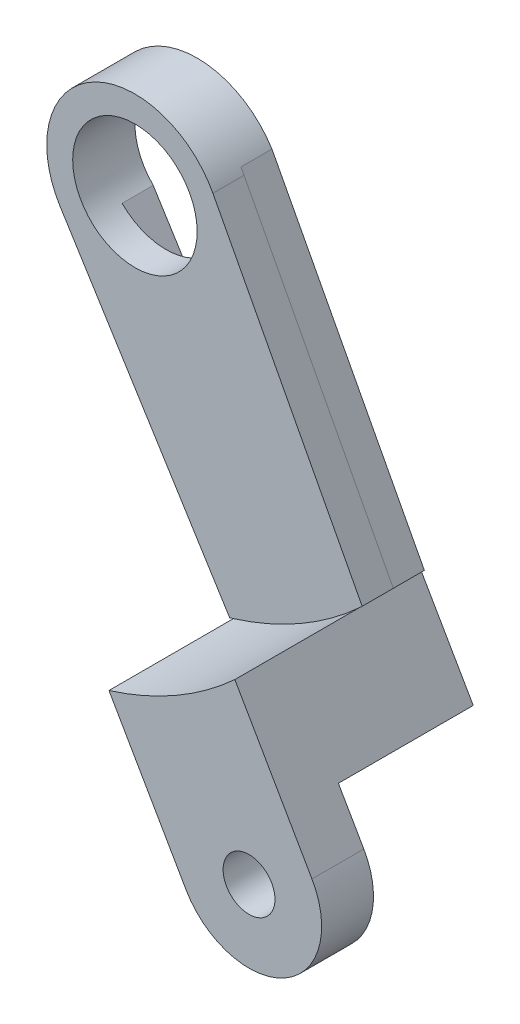
ISO-10303-21;
HEADER;
FILE_DESCRIPTION(('STEP AP214'),'2;1');
FILE_NAME('part.step','',(''),(''),'','','');
FILE_SCHEMA(('AUTOMOTIVE_DESIGN { 1 0 10303 214 1 1 1 1 }'));
ENDSEC;
DATA;
#1=APPLICATION_CONTEXT('core data for automotive mechanical design processes');
#2=APPLICATION_PROTOCOL_DEFINITION('international standard','automotive_design',2000,#1);
#3=PRODUCT_CONTEXT('',#1,'mechanical');
#4=PRODUCT('Part','Part','',(#3));
#5=PRODUCT_RELATED_PRODUCT_CATEGORY('part','',(#4));
#6=PRODUCT_DEFINITION_FORMATION('','',#4);
#7=PRODUCT_DEFINITION_CONTEXT('part definition',#1,'design');
#8=PRODUCT_DEFINITION('design','',#6,#7);
#9=PRODUCT_DEFINITION_SHAPE('','',#8);
#10=(LENGTH_UNIT() NAMED_UNIT(*) SI_UNIT(.MILLI.,.METRE.));
#11=(NAMED_UNIT(*) PLANE_ANGLE_UNIT() SI_UNIT($,.RADIAN.));
#12=(NAMED_UNIT(*) SI_UNIT($,.STERADIAN.) SOLID_ANGLE_UNIT());
#13=UNCERTAINTY_MEASURE_WITH_UNIT(LENGTH_MEASURE(1.E-05),#10,'distance_accuracy_value','');
#14=(GEOMETRIC_REPRESENTATION_CONTEXT(3) GLOBAL_UNCERTAINTY_ASSIGNED_CONTEXT((#13)) GLOBAL_UNIT_ASSIGNED_CONTEXT((#10,
#11,#12)) REPRESENTATION_CONTEXT('',''));
#15=CARTESIAN_POINT('',(0.,0.,0.));
#16=DIRECTION('',(0.,0.,1.));
#17=DIRECTION('',(1.,0.,0.));
#18=AXIS2_PLACEMENT_3D('',#15,#16,#17);
#19=CARTESIAN_POINT('',(0.,0.,-9.99999999999993));
#20=DIRECTION('',(0.,0.,-1.));
#21=DIRECTION('',(-1.,0.,0.));
#22=AXIS2_PLACEMENT_3D('',#19,#20,#21);
#23=PLANE('',#22);
#24=CARTESIAN_POINT('',(-23.,40.,-9.99999999999998));
#25=DIRECTION('',(0.,0.,-1.));
#26=DIRECTION('',(-1.,0.,0.));
#27=AXIS2_PLACEMENT_3D('',#24,#25,#26);
#28=CIRCLE('',#27,32.);
#29=CARTESIAN_POINT('',(-1.08989173755444,16.6773252835805,-9.99999999999994));
#30=VERTEX_POINT('',#29);
#31=CARTESIAN_POINT('',(-1.0940484145157,16.673421058063,-9.99999999999994));
#32=VERTEX_POINT('',#31);
#33=EDGE_CURVE('E240',#30,#32,#28,.T.);
#34=ORIENTED_EDGE('',*,*,#33,.T.);
#35=DIRECTION('',(-0.466979818866407,0.884267973394659,0.));
#36=VECTOR('',#35,1.);
#37=CARTESIAN_POINT('',(6.02957498273346,3.18420424350436,-9.99999999999993));
#38=LINE('',#37,#36);
#39=CARTESIAN_POINT('',(-15.7908519604501,44.5031305270727,-9.99999999999997));
#40=VERTEX_POINT('',#39);
#41=EDGE_CURVE('E216',#32,#40,#38,.T.);
#42=ORIENTED_EDGE('',*,*,#41,.T.);
#43=CARTESIAN_POINT('',(-23.,40.,-9.99999999999998));
#44=DIRECTION('',(0.,0.,-1.));
#45=DIRECTION('',(-1.,0.,0.));
#46=AXIS2_PLACEMENT_3D('',#43,#44,#45);
#47=CIRCLE('',#46,8.5);
#48=CARTESIAN_POINT('',(-15.4815604915824,43.965232320844,-9.99999999999997));
#49=VERTEX_POINT('',#48);
#50=EDGE_CURVE('E235',#40,#49,#47,.T.);
#51=ORIENTED_EDGE('',*,*,#50,.T.);
#52=DIRECTION('',(-0.46649792009929,0.884522295107951,0.));
#53=VECTOR('',#52,1.);
#54=CARTESIAN_POINT('',(6.02881906390013,3.17960504728839,-9.99999999999993));
#55=LINE('',#54,#53);
#56=EDGE_CURVE('E237',#30,#49,#55,.T.);
#57=ORIENTED_EDGE('',*,*,#56,.F.);
#58=EDGE_LOOP('',(#34,#42,#51,#57));
#59=FACE_BOUND('',#58,.T.);
#60=ADVANCED_FACE('F41',(#59),#23,.T.);
#61=CARTESIAN_POINT('',(0.,0.,0.));
#62=DIRECTION('',(0.,0.,1.));
#63=DIRECTION('',(1.,0.,0.));
#64=AXIS2_PLACEMENT_3D('',#61,#62,#63);
#65=PLANE('',#64);
#66=CARTESIAN_POINT('',(0.,0.,0.));
#67=DIRECTION('',(0.,0.,1.));
#68=DIRECTION('',(1.,0.,0.));
#69=AXIS2_PLACEMENT_3D('',#66,#67,#68);
#70=CIRCLE('',#69,2.5);
#71=CARTESIAN_POINT('',(2.5,0.,0.));
#72=VERTEX_POINT('',#71);
#73=EDGE_CURVE('E283',#72,#72,#70,.T.);
#74=ORIENTED_EDGE('',*,*,#73,.T.);
#75=EDGE_LOOP('',(#74));
#76=FACE_BOUND('',#75,.T.);
#77=DIRECTION('',(-0.866906303057535,-0.498471124258083,0.));
#78=VECTOR('',#77,1.);
#79=CARTESIAN_POINT('',(-2.45053289116354,4.26179633245834,0.));
#80=LINE('',#79,#78);
#81=CARTESIAN_POINT('',(3.6178112302392,7.75109420226491,0.));
#82=VERTEX_POINT('',#81);
#83=CARTESIAN_POINT('',(-8.51887701256629,0.772498462651754,0.));
#84=VERTEX_POINT('',#83);
#85=EDGE_CURVE('E64',#82,#84,#80,.T.);
#86=ORIENTED_EDGE('',*,*,#85,.F.);
#87=DIRECTION('',(-0.498471124258083,0.866906303057535,0.));
#88=VECTOR('',#87,1.);
#89=CARTESIAN_POINT('',(6.06834412140275,3.48929786980658,0.));
#90=LINE('',#89,#88);
#91=CARTESIAN_POINT('',(6.06834412140275,3.48929786980658,0.));
#92=VERTEX_POINT('',#91);
#93=EDGE_CURVE('E297',#92,#82,#90,.T.);
#94=ORIENTED_EDGE('',*,*,#93,.F.);
#95=CARTESIAN_POINT('',(0.,0.,0.));
#96=DIRECTION('',(0.,0.,1.));
#97=DIRECTION('',(1.,0.,0.));
#98=AXIS2_PLACEMENT_3D('',#95,#96,#97);
#99=CIRCLE('',#98,7.);
#100=CARTESIAN_POINT('',(-6.06834412140275,-3.48929786980658,0.));
#101=VERTEX_POINT('',#100);
#102=EDGE_CURVE('E295',#101,#92,#99,.T.);
#103=ORIENTED_EDGE('',*,*,#102,.F.);
#104=DIRECTION('',(-0.498471124258083,0.866906303057535,0.));
#105=VECTOR('',#104,1.);
#106=CARTESIAN_POINT('',(-6.06834412140275,-3.48929786980658,0.));
#107=LINE('',#106,#105);
#108=EDGE_CURVE('E278',#101,#84,#107,.T.);
#109=ORIENTED_EDGE('',*,*,#108,.T.);
#110=EDGE_LOOP('',(#86,#94,#103,#109));
#111=FACE_BOUND('',#110,.T.);
#112=ADVANCED_FACE('F314',(#76,#111),#65,.F.);
#113=CARTESIAN_POINT('',(-6.06834412140275,-3.48929786980658,5.));
#114=DIRECTION('',(-0.866906303057535,-0.498471124258083,0.));
#115=DIRECTION('',(0.498471124258083,-0.866906303057535,0.));
#116=AXIS2_PLACEMENT_3D('',#113,#114,#115);
#117=PLANE('',#116);
#118=ORIENTED_EDGE('',*,*,#108,.F.);
#119=DIRECTION('',(0.,0.,-1.));
#120=VECTOR('',#119,1.);
#121=CARTESIAN_POINT('',(-6.06834412140275,-3.48929786980658,5.));
#122=LINE('',#121,#120);
#123=CARTESIAN_POINT('',(-6.06834412140275,-3.48929786980658,5.));
#124=VERTEX_POINT('',#123);
#125=EDGE_CURVE('E11',#124,#101,#122,.T.);
#126=ORIENTED_EDGE('',*,*,#125,.F.);
#127=DIRECTION('',(-0.498471124258083,0.866906303057535,0.));
#128=VECTOR('',#127,1.);
#129=CARTESIAN_POINT('',(-6.06834412140275,-3.48929786980658,5.));
#130=LINE('',#129,#128);
#131=CARTESIAN_POINT('',(-13.5035882551471,9.44156149322711,5.));
#132=VERTEX_POINT('',#131);
#133=EDGE_CURVE('E279',#124,#132,#130,.T.);
#134=ORIENTED_EDGE('',*,*,#133,.T.);
#135=DIRECTION('',(0.,0.,-1.));
#136=VECTOR('',#135,1.);
#137=CARTESIAN_POINT('',(-13.5035882551471,9.44156149322711,5.));
#138=LINE('',#137,#136);
#139=CARTESIAN_POINT('',(-13.5035882551471,9.44156149322711,-6.99999999999993));
#140=VERTEX_POINT('',#139);
#141=EDGE_CURVE('E293',#132,#140,#138,.T.);
#142=ORIENTED_EDGE('',*,*,#141,.T.);
#143=DIRECTION('',(0.,0.,1.));
#144=VECTOR('',#143,1.);
#145=CARTESIAN_POINT('',(-13.5035882551471,9.4415614932271,-9.99999999999995));
#146=LINE('',#145,#144);
#147=CARTESIAN_POINT('',(-13.5035882551471,9.44156149322711,-13.));
#148=VERTEX_POINT('',#147);
#149=EDGE_CURVE('E258',#148,#140,#146,.T.);
#150=ORIENTED_EDGE('',*,*,#149,.F.);
#151=DIRECTION('',(-0.498471124258083,0.866906303057535,0.));
#152=VECTOR('',#151,1.);
#153=CARTESIAN_POINT('',(-6.06834412140274,-3.48929786980659,-12.9999999999999));
#154=LINE('',#153,#152);
#155=CARTESIAN_POINT('',(-8.51887701256628,0.772498462651755,-12.9999999999999));
#156=VERTEX_POINT('',#155);
#157=EDGE_CURVE('E212',#156,#148,#154,.T.);
#158=ORIENTED_EDGE('',*,*,#157,.F.);
#159=DIRECTION('',(0.,0.,1.));
#160=VECTOR('',#159,1.);
#161=CARTESIAN_POINT('',(-8.51887701256629,0.772498462651754,-31.1946447553404));
#162=LINE('',#161,#160);
#163=EDGE_CURVE('E269',#156,#84,#162,.T.);
#164=ORIENTED_EDGE('',*,*,#163,.T.);
#165=EDGE_LOOP('',(#118,#126,#134,#142,#150,#158,#164));
#166=FACE_BOUND('',#165,.T.);
#167=ADVANCED_FACE('F43',(#166),#117,.T.);
#168=CARTESIAN_POINT('',(0.,0.,5.));
#169=DIRECTION('',(0.,0.,-1.));
#170=DIRECTION('',(-1.,0.,0.));
#171=AXIS2_PLACEMENT_3D('',#168,#169,#170);
#172=CYLINDRICAL_SURFACE('',#171,7.);
#173=ORIENTED_EDGE('',*,*,#102,.T.);
#174=DIRECTION('',(0.,0.,-1.));
#175=VECTOR('',#174,1.);
#176=CARTESIAN_POINT('',(6.06834412140275,3.48929786980658,5.));
#177=LINE('',#176,#175);
#178=CARTESIAN_POINT('',(6.06834412140275,3.48929786980658,5.));
#179=VERTEX_POINT('',#178);
#180=EDGE_CURVE('E49',#179,#92,#177,.T.);
#181=ORIENTED_EDGE('',*,*,#180,.F.);
#182=CARTESIAN_POINT('',(0.,0.,5.));
#183=DIRECTION('',(0.,0.,1.));
#184=DIRECTION('',(1.,0.,0.));
#185=AXIS2_PLACEMENT_3D('',#182,#183,#184);
#186=CIRCLE('',#185,7.);
#187=EDGE_CURVE('E282',#124,#179,#186,.T.);
#188=ORIENTED_EDGE('',*,*,#187,.F.);
#189=ORIENTED_EDGE('',*,*,#125,.T.);
#190=EDGE_LOOP('',(#173,#181,#188,#189));
#191=FACE_BOUND('',#190,.T.);
#192=ADVANCED_FACE('F337',(#191),#172,.T.);
#193=CARTESIAN_POINT('',(6.06834412140275,3.48929786980658,5.));
#194=DIRECTION('',(-0.866906303057535,-0.498471124258083,0.));
#195=DIRECTION('',(0.498471124258083,-0.866906303057535,0.));
#196=AXIS2_PLACEMENT_3D('',#193,#194,#195);
#197=PLANE('',#196);
#198=ORIENTED_EDGE('',*,*,#93,.T.);
#199=DIRECTION('',(0.,0.,1.));
#200=VECTOR('',#199,1.);
#201=CARTESIAN_POINT('',(3.6178112302392,7.75109420226492,-31.1946447553404));
#202=LINE('',#201,#200);
#203=CARTESIAN_POINT('',(3.61781123023921,7.75109420226491,-12.9999999999999));
#204=VERTEX_POINT('',#203);
#205=EDGE_CURVE('E272',#204,#82,#202,.T.);
#206=ORIENTED_EDGE('',*,*,#205,.F.);
#207=DIRECTION('',(0.498471124258083,-0.866906303057535,0.));
#208=VECTOR('',#207,1.);
#209=CARTESIAN_POINT('',(6.06834412140276,3.48929786980657,-12.9999999999999));
#210=LINE('',#209,#208);
#211=CARTESIAN_POINT('',(-1.36690001234163,16.4201572328403,-12.9999999999999));
#212=VERTEX_POINT('',#211);
#213=EDGE_CURVE('E197',#212,#204,#210,.T.);
#214=ORIENTED_EDGE('',*,*,#213,.F.);
#215=DIRECTION('',(0.,0.,1.));
#216=VECTOR('',#215,1.);
#217=CARTESIAN_POINT('',(-1.36690001234162,16.4201572328403,-9.99999999999994));
#218=LINE('',#217,#216);
#219=CARTESIAN_POINT('',(-1.36690001234163,16.4201572328403,-6.99999999999994));
#220=VERTEX_POINT('',#219);
#221=EDGE_CURVE('E261',#212,#220,#218,.T.);
#222=ORIENTED_EDGE('',*,*,#221,.T.);
#223=DIRECTION('',(0.,0.,-1.));
#224=VECTOR('',#223,1.);
#225=CARTESIAN_POINT('',(-1.36690001234163,16.4201572328403,5.));
#226=LINE('',#225,#224);
#227=CARTESIAN_POINT('',(-1.36690001234163,16.4201572328403,5.));
#228=VERTEX_POINT('',#227);
#229=EDGE_CURVE('E303',#228,#220,#226,.T.);
#230=ORIENTED_EDGE('',*,*,#229,.F.);
#231=DIRECTION('',(-0.498471124258083,0.866906303057535,0.));
#232=VECTOR('',#231,1.);
#233=CARTESIAN_POINT('',(6.06834412140275,3.48929786980658,5.));
#234=LINE('',#233,#232);
#235=EDGE_CURVE('E285',#179,#228,#234,.T.);
#236=ORIENTED_EDGE('',*,*,#235,.F.);
#237=ORIENTED_EDGE('',*,*,#180,.T.);
#238=EDGE_LOOP('',(#198,#206,#214,#222,#230,#236,#237));
#239=FACE_BOUND('',#238,.T.);
#240=ADVANCED_FACE('F309',(#239),#197,.F.);
#241=CARTESIAN_POINT('',(-23.,40.,5.));
#242=DIRECTION('',(0.,0.,-1.));
#243=DIRECTION('',(-1.,0.,0.));
#244=AXIS2_PLACEMENT_3D('',#241,#242,#243);
#245=CYLINDRICAL_SURFACE('',#244,32.);
#246=ORIENTED_EDGE('',*,*,#229,.T.);
#247=CARTESIAN_POINT('',(-23.,40.,-6.99999999999998));
#248=DIRECTION('',(0.,0.,1.));
#249=DIRECTION('',(1.,0.,0.));
#250=AXIS2_PLACEMENT_3D('',#247,#248,#249);
#251=CIRCLE('',#250,32.);
#252=EDGE_CURVE('E275',#220,#140,#251,.F.);
#253=ORIENTED_EDGE('',*,*,#252,.T.);
#254=ORIENTED_EDGE('',*,*,#141,.F.);
#255=CARTESIAN_POINT('',(-23.,40.,5.));
#256=DIRECTION('',(0.,0.,1.));
#257=DIRECTION('',(1.,0.,0.));
#258=AXIS2_PLACEMENT_3D('',#255,#256,#257);
#259=CIRCLE('',#258,32.);
#260=EDGE_CURVE('E287',#132,#228,#259,.T.);
#261=ORIENTED_EDGE('',*,*,#260,.T.);
#262=EDGE_LOOP('',(#246,#253,#254,#261));
#263=FACE_BOUND('',#262,.T.);
#264=ADVANCED_FACE('F331',(#263),#245,.F.);
#265=CARTESIAN_POINT('',(0.,0.,5.));
#266=DIRECTION('',(0.,0.,-1.));
#267=DIRECTION('',(-1.,0.,0.));
#268=AXIS2_PLACEMENT_3D('',#265,#266,#267);
#269=CYLINDRICAL_SURFACE('',#268,2.5);
#270=CARTESIAN_POINT('',(0.,0.,5.));
#271=DIRECTION('',(0.,0.,1.));
#272=DIRECTION('',(1.,0.,0.));
#273=AXIS2_PLACEMENT_3D('',#270,#271,#272);
#274=CIRCLE('',#273,2.5);
#275=CARTESIAN_POINT('',(2.5,0.,5.));
#276=VERTEX_POINT('',#275);
#277=EDGE_CURVE('E290',#276,#276,#274,.T.);
#278=ORIENTED_EDGE('',*,*,#277,.T.);
#279=EDGE_LOOP('',(#278));
#280=FACE_BOUND('',#279,.T.);
#281=ORIENTED_EDGE('',*,*,#73,.F.);
#282=EDGE_LOOP('',(#281));
#283=FACE_BOUND('',#282,.T.);
#284=ADVANCED_FACE('F403',(#280,#283),#269,.F.);
#285=CARTESIAN_POINT('',(0.,0.,5.));
#286=DIRECTION('',(0.,0.,1.));
#287=DIRECTION('',(1.,0.,0.));
#288=AXIS2_PLACEMENT_3D('',#285,#286,#287);
#289=PLANE('',#288);
#290=ORIENTED_EDGE('',*,*,#133,.F.);
#291=ORIENTED_EDGE('',*,*,#187,.T.);
#292=ORIENTED_EDGE('',*,*,#235,.T.);
#293=ORIENTED_EDGE('',*,*,#260,.F.);
#294=EDGE_LOOP('',(#290,#291,#292,#293));
#295=FACE_BOUND('',#294,.T.);
#296=ORIENTED_EDGE('',*,*,#277,.F.);
#297=EDGE_LOOP('',(#296));
#298=FACE_BOUND('',#297,.T.);
#299=ADVANCED_FACE('F335',(#295,#298),#289,.T.);
#300=CARTESIAN_POINT('',(-2.45053289116354,4.26179633245834,-31.1946447553404));
#301=DIRECTION('',(-0.498471124258083,0.866906303057535,0.));
#302=DIRECTION('',(-0.866906303057535,-0.498471124258083,0.));
#303=AXIS2_PLACEMENT_3D('',#300,#301,#302);
#304=PLANE('',#303);
#305=ORIENTED_EDGE('',*,*,#163,.F.);
#306=DIRECTION('',(-0.866906303057535,-0.498471124258083,0.));
#307=VECTOR('',#306,1.);
#308=CARTESIAN_POINT('',(-2.45053289116353,4.26179633245834,-12.9999999999999));
#309=LINE('',#308,#307);
#310=CARTESIAN_POINT('',(-6.21537812278591,2.09701032427547,-12.9999999999999));
#311=VERTEX_POINT('',#310);
#312=EDGE_CURVE('E209',#311,#156,#309,.T.);
#313=ORIENTED_EDGE('',*,*,#312,.F.);
#314=DIRECTION('',(0.,0.,1.));
#315=VECTOR('',#314,1.);
#316=CARTESIAN_POINT('',(-6.21537812278591,2.09701032427547,-12.9999999999999));
#317=LINE('',#316,#315);
#318=CARTESIAN_POINT('',(-6.21537812278592,2.09701032427547,-9.99999999999994));
#319=VERTEX_POINT('',#318);
#320=EDGE_CURVE('E215',#311,#319,#317,.T.);
#321=ORIENTED_EDGE('',*,*,#320,.T.);
#322=DIRECTION('',(-0.866906303057535,-0.498471124258083,0.));
#323=VECTOR('',#322,1.);
#324=CARTESIAN_POINT('',(-2.45053289116353,4.26179633245834,-9.99999999999994));
#325=LINE('',#324,#323);
#326=CARTESIAN_POINT('',(1.32040378030427,6.43008491855232,-9.99999999999993));
#327=VERTEX_POINT('',#326);
#328=EDGE_CURVE('E174',#327,#319,#325,.T.);
#329=ORIENTED_EDGE('',*,*,#328,.F.);
#330=DIRECTION('',(0.,0.,1.));
#331=VECTOR('',#330,1.);
#332=CARTESIAN_POINT('',(1.32040378030427,6.43008491855232,-12.9999999999999));
#333=LINE('',#332,#331);
#334=CARTESIAN_POINT('',(1.32040378030427,6.43008491855232,-12.9999999999999));
#335=VERTEX_POINT('',#334);
#336=EDGE_CURVE('E226',#335,#327,#333,.T.);
#337=ORIENTED_EDGE('',*,*,#336,.F.);
#338=DIRECTION('',(-0.866906303057535,-0.498471124258083,0.));
#339=VECTOR('',#338,1.);
#340=CARTESIAN_POINT('',(-2.45053289116353,4.26179633245834,-12.9999999999999));
#341=LINE('',#340,#339);
#342=EDGE_CURVE('E200',#204,#335,#341,.T.);
#343=ORIENTED_EDGE('',*,*,#342,.F.);
#344=ORIENTED_EDGE('',*,*,#205,.T.);
#345=ORIENTED_EDGE('',*,*,#85,.T.);
#346=EDGE_LOOP('',(#305,#313,#321,#329,#337,#343,#344,#345));
#347=FACE_BOUND('',#346,.T.);
#348=ADVANCED_FACE('F320',(#347),#304,.F.);
#349=CARTESIAN_POINT('',(0.,0.,-6.99999999999993));
#350=DIRECTION('',(0.,0.,-1.));
#351=DIRECTION('',(-1.,0.,0.));
#352=AXIS2_PLACEMENT_3D('',#349,#350,#351);
#353=PLANE('',#352);
#354=CARTESIAN_POINT('',(-23.,40.,-6.99999999999998));
#355=DIRECTION('',(0.,0.,-1.));
#356=DIRECTION('',(-1.,0.,0.));
#357=AXIS2_PLACEMENT_3D('',#354,#355,#356);
#358=CIRCLE('',#357,6.);
#359=CARTESIAN_POINT('',(-29.,40.,-6.99999999999999));
#360=VERTEX_POINT('',#359);
#361=EDGE_CURVE('E231',#360,#360,#358,.T.);
#362=ORIENTED_EDGE('',*,*,#361,.T.);
#363=EDGE_LOOP('',(#362));
#364=FACE_BOUND('',#363,.T.);
#365=ORIENTED_EDGE('',*,*,#252,.F.);
#366=CARTESIAN_POINT('',(-23.,40.,-6.99999999999998));
#367=DIRECTION('',(0.,0.,-1.));
#368=DIRECTION('',(-1.,0.,0.));
#369=AXIS2_PLACEMENT_3D('',#366,#367,#368);
#370=CIRCLE('',#369,32.);
#371=CARTESIAN_POINT('',(-1.08989173755444,16.6773252835805,-6.99999999999994));
#372=VERTEX_POINT('',#371);
#373=EDGE_CURVE('E252',#372,#220,#370,.T.);
#374=ORIENTED_EDGE('',*,*,#373,.F.);
#375=DIRECTION('',(-0.46649792009929,0.884522295107951,0.));
#376=VECTOR('',#375,1.);
#377=CARTESIAN_POINT('',(6.02881906390013,3.17960504728839,-6.99999999999993));
#378=LINE('',#377,#376);
#379=CARTESIAN_POINT('',(-15.4815604915824,43.965232320844,-6.99999999999997));
#380=VERTEX_POINT('',#379);
#381=EDGE_CURVE('E249',#372,#380,#378,.T.);
#382=ORIENTED_EDGE('',*,*,#381,.T.);
#383=CARTESIAN_POINT('',(-23.,40.,-6.99999999999998));
#384=DIRECTION('',(0.,0.,-1.));
#385=DIRECTION('',(-1.,0.,0.));
#386=AXIS2_PLACEMENT_3D('',#383,#384,#385);
#387=CIRCLE('',#386,8.5);
#388=CARTESIAN_POINT('',(-30.2091480431508,35.4968694786921,-6.99999999999999));
#389=VERTEX_POINT('',#388);
#390=EDGE_CURVE('E247',#389,#380,#387,.T.);
#391=ORIENTED_EDGE('',*,*,#390,.F.);
#392=DIRECTION('',(-0.529780061330338,0.848135063900098,0.));
#393=VECTOR('',#392,1.);
#394=CARTESIAN_POINT('',(-5.78080718856162,-3.61093004787711,-6.99999999999994));
#395=LINE('',#394,#393);
#396=CARTESIAN_POINT('',(-13.8651970271805,9.33152474204549,-6.99999999999995));
#397=VERTEX_POINT('',#396);
#398=EDGE_CURVE('E169',#397,#389,#395,.T.);
#399=ORIENTED_EDGE('',*,*,#398,.F.);
#400=EDGE_CURVE('E255',#140,#397,#370,.T.);
#401=ORIENTED_EDGE('',*,*,#400,.F.);
#402=EDGE_LOOP('',(#365,#374,#382,#391,#399,#401));
#403=FACE_BOUND('',#402,.T.);
#404=ADVANCED_FACE('F383',(#364,#403),#353,.F.);
#405=CARTESIAN_POINT('',(-23.,40.,-9.99999999999998));
#406=DIRECTION('',(0.,0.,1.));
#407=DIRECTION('',(1.,0.,0.));
#408=AXIS2_PLACEMENT_3D('',#405,#406,#407);
#409=CYLINDRICAL_SURFACE('',#408,8.5);
#410=ORIENTED_EDGE('',*,*,#390,.T.);
#411=DIRECTION('',(0.,0.,1.));
#412=VECTOR('',#411,1.);
#413=CARTESIAN_POINT('',(-15.4815604915824,43.965232320844,-9.99999999999997));
#414=LINE('',#413,#412);
#415=EDGE_CURVE('E266',#49,#380,#414,.T.);
#416=ORIENTED_EDGE('',*,*,#415,.F.);
#417=ORIENTED_EDGE('',*,*,#50,.F.);
#418=DIRECTION('',(0.,0.,1.));
#419=VECTOR('',#418,1.);
#420=CARTESIAN_POINT('',(-15.7908519604501,44.5031305270727,-13.));
#421=LINE('',#420,#419);
#422=CARTESIAN_POINT('',(-15.7908519604501,44.5031305270727,-13.));
#423=VERTEX_POINT('',#422);
#424=EDGE_CURVE('E56',#423,#40,#421,.T.);
#425=ORIENTED_EDGE('',*,*,#424,.F.);
#426=CARTESIAN_POINT('',(-23.,40.,-13.));
#427=DIRECTION('',(0.,0.,-1.));
#428=DIRECTION('',(-1.,0.,0.));
#429=AXIS2_PLACEMENT_3D('',#426,#427,#428);
#430=CIRCLE('',#429,8.5);
#431=CARTESIAN_POINT('',(-30.2091480431508,35.4968694786921,-13.));
#432=VERTEX_POINT('',#431);
#433=EDGE_CURVE('E176',#432,#423,#430,.T.);
#434=ORIENTED_EDGE('',*,*,#433,.F.);
#435=DIRECTION('',(0.,0.,1.));
#436=VECTOR('',#435,1.);
#437=CARTESIAN_POINT('',(-30.2091480431508,35.4968694786921,-9.99999999999999));
#438=LINE('',#437,#436);
#439=EDGE_CURVE('E162',#432,#389,#438,.T.);
#440=ORIENTED_EDGE('',*,*,#439,.T.);
#441=EDGE_LOOP('',(#410,#416,#417,#425,#434,#440));
#442=FACE_BOUND('',#441,.T.);
#443=ADVANCED_FACE('F177',(#442),#409,.T.);
#444=CARTESIAN_POINT('',(6.02881906390013,3.17960504728839,-9.99999999999993));
#445=DIRECTION('',(0.88452229510795,0.46649792009929,0.));
#446=DIRECTION('',(-0.46649792009929,0.884522295107951,0.));
#447=AXIS2_PLACEMENT_3D('',#444,#445,#446);
#448=PLANE('',#447);
#449=ORIENTED_EDGE('',*,*,#381,.F.);
#450=DIRECTION('',(0.,0.,1.));
#451=VECTOR('',#450,1.);
#452=CARTESIAN_POINT('',(-1.08989173755444,16.6773252835805,-9.99999999999994));
#453=LINE('',#452,#451);
#454=EDGE_CURVE('E264',#30,#372,#453,.T.);
#455=ORIENTED_EDGE('',*,*,#454,.F.);
#456=ORIENTED_EDGE('',*,*,#56,.T.);
#457=ORIENTED_EDGE('',*,*,#415,.T.);
#458=EDGE_LOOP('',(#449,#455,#456,#457));
#459=FACE_BOUND('',#458,.T.);
#460=ADVANCED_FACE('F388',(#459),#448,.T.);
#461=CARTESIAN_POINT('',(-23.,40.,-9.99999999999998));
#462=DIRECTION('',(0.,0.,1.));
#463=DIRECTION('',(1.,0.,0.));
#464=AXIS2_PLACEMENT_3D('',#461,#462,#463);
#465=CYLINDRICAL_SURFACE('',#464,32.);
#466=ORIENTED_EDGE('',*,*,#373,.T.);
#467=ORIENTED_EDGE('',*,*,#221,.F.);
#468=CARTESIAN_POINT('',(-23.,40.,-13.));
#469=DIRECTION('',(0.,0.,-1.));
#470=DIRECTION('',(-1.,0.,0.));
#471=AXIS2_PLACEMENT_3D('',#468,#469,#470);
#472=CIRCLE('',#471,32.);
#473=CARTESIAN_POINT('',(-1.09404841451569,16.673421058063,-12.9999999999999));
#474=VERTEX_POINT('',#473);
#475=EDGE_CURVE('E194',#474,#212,#472,.T.);
#476=ORIENTED_EDGE('',*,*,#475,.F.);
#477=DIRECTION('',(0.,0.,1.));
#478=VECTOR('',#477,1.);
#479=CARTESIAN_POINT('',(-1.09404841451569,16.673421058063,-12.9999999999999));
#480=LINE('',#479,#478);
#481=EDGE_CURVE('E228',#474,#32,#480,.T.);
#482=ORIENTED_EDGE('',*,*,#481,.T.);
#483=ORIENTED_EDGE('',*,*,#33,.F.);
#484=ORIENTED_EDGE('',*,*,#454,.T.);
#485=EDGE_LOOP('',(#466,#467,#476,#482,#483,#484));
#486=FACE_BOUND('',#485,.T.);
#487=ADVANCED_FACE('F327',(#486),#465,.T.);
#488=ORIENTED_EDGE('',*,*,#400,.T.);
#489=DIRECTION('',(0.,0.,1.));
#490=VECTOR('',#489,1.);
#491=CARTESIAN_POINT('',(-13.8651970271805,9.33152474204549,-9.99999999999996));
#492=LINE('',#491,#490);
#493=CARTESIAN_POINT('',(-13.8651970271805,9.33152474204549,-13.));
#494=VERTEX_POINT('',#493);
#495=EDGE_CURVE('E173',#494,#397,#492,.T.);
#496=ORIENTED_EDGE('',*,*,#495,.F.);
#497=CARTESIAN_POINT('',(-23.,40.,-13.));
#498=DIRECTION('',(0.,0.,-1.));
#499=DIRECTION('',(-1.,0.,0.));
#500=AXIS2_PLACEMENT_3D('',#497,#498,#499);
#501=CIRCLE('',#500,32.);
#502=EDGE_CURVE('E187',#148,#494,#501,.T.);
#503=ORIENTED_EDGE('',*,*,#502,.F.);
#504=ORIENTED_EDGE('',*,*,#149,.T.);
#505=EDGE_LOOP('',(#488,#496,#503,#504));
#506=FACE_BOUND('',#505,.T.);
#507=ADVANCED_FACE('F381',(#506),#465,.T.);
#508=CARTESIAN_POINT('',(-23.,40.,-9.99999999999998));
#509=DIRECTION('',(0.,0.,1.));
#510=DIRECTION('',(1.,0.,0.));
#511=AXIS2_PLACEMENT_3D('',#508,#509,#510);
#512=CYLINDRICAL_SURFACE('',#511,6.);
#513=CARTESIAN_POINT('',(-23.,40.,-9.99999999999998));
#514=DIRECTION('',(0.,0.,-1.));
#515=DIRECTION('',(-1.,0.,0.));
#516=AXIS2_PLACEMENT_3D('',#513,#514,#515);
#517=CIRCLE('',#516,6.);
#518=CARTESIAN_POINT('',(-17.181735722842,41.4655377174085,-9.99999999999997));
#519=VERTEX_POINT('',#518);
#520=CARTESIAN_POINT('',(-27.2383228614829,35.7530458771219,-9.99999999999998));
#521=VERTEX_POINT('',#520);
#522=EDGE_CURVE('E232',#519,#521,#517,.T.);
#523=ORIENTED_EDGE('',*,*,#522,.T.);
#524=DIRECTION('',(0.,0.,1.));
#525=VECTOR('',#524,1.);
#526=CARTESIAN_POINT('',(-27.2383228614829,35.7530458771219,-13.));
#527=LINE('',#526,#525);
#528=CARTESIAN_POINT('',(-27.2383228614829,35.7530458771219,-13.));
#529=VERTEX_POINT('',#528);
#530=EDGE_CURVE('E222',#529,#521,#527,.T.);
#531=ORIENTED_EDGE('',*,*,#530,.F.);
#532=CARTESIAN_POINT('',(-23.,40.,-13.));
#533=DIRECTION('',(0.,0.,-1.));
#534=DIRECTION('',(-1.,0.,0.));
#535=AXIS2_PLACEMENT_3D('',#532,#533,#534);
#536=CIRCLE('',#535,6.);
#537=CARTESIAN_POINT('',(-17.181735722842,41.4655377174085,-13.));
#538=VERTEX_POINT('',#537);
#539=EDGE_CURVE('E205',#538,#529,#536,.F.);
#540=ORIENTED_EDGE('',*,*,#539,.F.);
#541=DIRECTION('',(0.,0.,1.));
#542=VECTOR('',#541,1.);
#543=CARTESIAN_POINT('',(-17.181735722842,41.4655377174085,-13.));
#544=LINE('',#543,#542);
#545=EDGE_CURVE('E224',#538,#519,#544,.T.);
#546=ORIENTED_EDGE('',*,*,#545,.T.);
#547=EDGE_LOOP('',(#523,#531,#540,#546));
#548=FACE_BOUND('',#547,.T.);
#549=ORIENTED_EDGE('',*,*,#361,.F.);
#550=EDGE_LOOP('',(#549));
#551=FACE_BOUND('',#550,.T.);
#552=ADVANCED_FACE('F365',(#548,#551),#512,.F.);
#553=CARTESIAN_POINT('',(-5.78080718856161,-3.61093004787711,-9.99999999999994));
#554=DIRECTION('',(0.848135063900098,0.529780061330338,0.));
#555=DIRECTION('',(-0.529780061330338,0.848135063900098,0.));
#556=AXIS2_PLACEMENT_3D('',#553,#554,#555);
#557=PLANE('',#556);
#558=ORIENTED_EDGE('',*,*,#398,.T.);
#559=ORIENTED_EDGE('',*,*,#439,.F.);
#560=DIRECTION('',(-0.529780061330338,0.848135063900098,0.));
#561=VECTOR('',#560,1.);
#562=CARTESIAN_POINT('',(-5.78080718856161,-3.61093004787711,-12.9999999999999));
#563=LINE('',#562,#561);
#564=EDGE_CURVE('E167',#494,#432,#563,.T.);
#565=ORIENTED_EDGE('',*,*,#564,.F.);
#566=ORIENTED_EDGE('',*,*,#495,.T.);
#567=EDGE_LOOP('',(#558,#559,#565,#566));
#568=FACE_BOUND('',#567,.T.);
#569=ADVANCED_FACE('F164',(#568),#557,.F.);
#570=DIRECTION('',(0.529780061330338,-0.848135063900098,0.));
#571=VECTOR('',#570,1.);
#572=CARTESIAN_POINT('',(-3.52868786878148,-2.20416364693405,-9.99999999999994));
#573=LINE('',#572,#571);
#574=EDGE_CURVE('E188',#521,#319,#573,.T.);
#575=ORIENTED_EDGE('',*,*,#574,.F.);
#576=ORIENTED_EDGE('',*,*,#522,.F.);
#577=DIRECTION('',(0.466979818866407,-0.884267973394659,0.));
#578=VECTOR('',#577,1.);
#579=CARTESIAN_POINT('',(3.687672160549,1.94745091916076,-9.99999999999993));
#580=LINE('',#579,#578);
#581=EDGE_CURVE('E190',#519,#327,#580,.T.);
#582=ORIENTED_EDGE('',*,*,#581,.T.);
#583=ORIENTED_EDGE('',*,*,#328,.T.);
#584=EDGE_LOOP('',(#575,#576,#582,#583));
#585=FACE_BOUND('',#584,.T.);
#586=ADVANCED_FACE('F348',(#585),#23,.T.);
#587=CARTESIAN_POINT('',(6.02957498273346,3.18420424350436,-12.9999999999999));
#588=DIRECTION('',(0.884267973394659,0.466979818866407,0.));
#589=DIRECTION('',(-0.466979818866407,0.884267973394659,0.));
#590=AXIS2_PLACEMENT_3D('',#587,#588,#589);
#591=PLANE('',#590);
#592=ORIENTED_EDGE('',*,*,#41,.F.);
#593=ORIENTED_EDGE('',*,*,#481,.F.);
#594=DIRECTION('',(-0.466979818866407,0.884267973394659,0.));
#595=VECTOR('',#594,1.);
#596=CARTESIAN_POINT('',(6.02957498273346,3.18420424350436,-12.9999999999999));
#597=LINE('',#596,#595);
#598=EDGE_CURVE('E181',#474,#423,#597,.T.);
#599=ORIENTED_EDGE('',*,*,#598,.T.);
#600=ORIENTED_EDGE('',*,*,#424,.T.);
#601=EDGE_LOOP('',(#592,#593,#599,#600));
#602=FACE_BOUND('',#601,.T.);
#603=ADVANCED_FACE('F358',(#602),#591,.T.);
#604=CARTESIAN_POINT('',(3.687672160549,1.94745091916076,-12.9999999999999));
#605=DIRECTION('',(-0.884267973394659,-0.466979818866407,0.));
#606=DIRECTION('',(0.466979818866407,-0.884267973394659,0.));
#607=AXIS2_PLACEMENT_3D('',#604,#605,#606);
#608=PLANE('',#607);
#609=ORIENTED_EDGE('',*,*,#581,.F.);
#610=ORIENTED_EDGE('',*,*,#545,.F.);
#611=DIRECTION('',(0.466979818866407,-0.884267973394659,0.));
#612=VECTOR('',#611,1.);
#613=CARTESIAN_POINT('',(3.687672160549,1.94745091916076,-12.9999999999999));
#614=LINE('',#613,#612);
#615=EDGE_CURVE('E202',#538,#335,#614,.T.);
#616=ORIENTED_EDGE('',*,*,#615,.T.);
#617=ORIENTED_EDGE('',*,*,#336,.T.);
#618=EDGE_LOOP('',(#609,#610,#616,#617));
#619=FACE_BOUND('',#618,.T.);
#620=ADVANCED_FACE('F364',(#619),#608,.T.);
#621=CARTESIAN_POINT('',(-3.52868786878147,-2.20416364693405,-12.9999999999999));
#622=DIRECTION('',(-0.848135063900098,-0.529780061330338,0.));
#623=DIRECTION('',(0.529780061330338,-0.848135063900098,0.));
#624=AXIS2_PLACEMENT_3D('',#621,#622,#623);
#625=PLANE('',#624);
#626=ORIENTED_EDGE('',*,*,#574,.T.);
#627=ORIENTED_EDGE('',*,*,#320,.F.);
#628=DIRECTION('',(0.529780061330338,-0.848135063900098,0.));
#629=VECTOR('',#628,1.);
#630=CARTESIAN_POINT('',(-3.52868786878147,-2.20416364693405,-12.9999999999999));
#631=LINE('',#630,#629);
#632=EDGE_CURVE('E207',#529,#311,#631,.T.);
#633=ORIENTED_EDGE('',*,*,#632,.F.);
#634=ORIENTED_EDGE('',*,*,#530,.T.);
#635=EDGE_LOOP('',(#626,#627,#633,#634));
#636=FACE_BOUND('',#635,.T.);
#637=ADVANCED_FACE('F379',(#636),#625,.F.);
#638=CARTESIAN_POINT('',(0.,0.,-12.9999999999999));
#639=DIRECTION('',(0.,0.,-1.));
#640=DIRECTION('',(-1.,0.,0.));
#641=AXIS2_PLACEMENT_3D('',#638,#639,#640);
#642=PLANE('',#641);
#643=ORIENTED_EDGE('',*,*,#564,.T.);
#644=ORIENTED_EDGE('',*,*,#433,.T.);
#645=ORIENTED_EDGE('',*,*,#598,.F.);
#646=ORIENTED_EDGE('',*,*,#475,.T.);
#647=ORIENTED_EDGE('',*,*,#213,.T.);
#648=ORIENTED_EDGE('',*,*,#342,.T.);
#649=ORIENTED_EDGE('',*,*,#615,.F.);
#650=ORIENTED_EDGE('',*,*,#539,.T.);
#651=ORIENTED_EDGE('',*,*,#632,.T.);
#652=ORIENTED_EDGE('',*,*,#312,.T.);
#653=ORIENTED_EDGE('',*,*,#157,.T.);
#654=ORIENTED_EDGE('',*,*,#502,.T.);
#655=EDGE_LOOP('',(#643,#644,#645,#646,#647,#648,#649,#650,#651,#652,#653,#654));
#656=FACE_BOUND('',#655,.T.);
#657=ADVANCED_FACE('F184',(#656),#642,.T.);
#658=CLOSED_SHELL('',(#60,#112,#167,#192,#240,#264,#284,#299,#348,#404,#443,#460,#487,#507,#552,
#569,#586,#603,#620,#637,#657));
#659=MANIFOLD_SOLID_BREP('B2',#658);
#660=ADVANCED_BREP_SHAPE_REPRESENTATION('',(#18,#659),#14);
#661=SHAPE_DEFINITION_REPRESENTATION(#9,#660);
ENDSEC;
END-ISO-10303-21;
